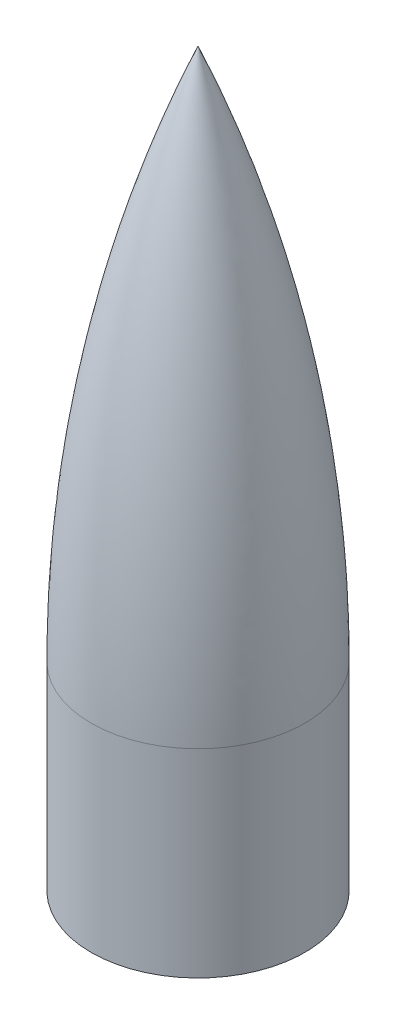
ISO-10303-21;
HEADER;
FILE_DESCRIPTION(('STEP AP214'),'2;1');
FILE_NAME('part.step','',(''),(''),'','','');
FILE_SCHEMA(('AUTOMOTIVE_DESIGN { 1 0 10303 214 1 1 1 1 }'));
ENDSEC;
DATA;
#1=APPLICATION_CONTEXT('core data for automotive mechanical design processes');
#2=APPLICATION_PROTOCOL_DEFINITION('international standard','automotive_design',2000,#1);
#3=PRODUCT_CONTEXT('',#1,'mechanical');
#4=PRODUCT('Part','Part','',(#3));
#5=PRODUCT_RELATED_PRODUCT_CATEGORY('part','',(#4));
#6=PRODUCT_DEFINITION_FORMATION('','',#4);
#7=PRODUCT_DEFINITION_CONTEXT('part definition',#1,'design');
#8=PRODUCT_DEFINITION('design','',#6,#7);
#9=PRODUCT_DEFINITION_SHAPE('','',#8);
#10=(LENGTH_UNIT() NAMED_UNIT(*) SI_UNIT(.MILLI.,.METRE.));
#11=(NAMED_UNIT(*) PLANE_ANGLE_UNIT() SI_UNIT($,.RADIAN.));
#12=(NAMED_UNIT(*) SI_UNIT($,.STERADIAN.) SOLID_ANGLE_UNIT());
#13=UNCERTAINTY_MEASURE_WITH_UNIT(LENGTH_MEASURE(1.E-05),#10,'distance_accuracy_value','');
#14=(GEOMETRIC_REPRESENTATION_CONTEXT(3) GLOBAL_UNCERTAINTY_ASSIGNED_CONTEXT((#13)) GLOBAL_UNIT_ASSIGNED_CONTEXT((#10,
#11,#12)) REPRESENTATION_CONTEXT('',''));
#15=CARTESIAN_POINT('',(0.,0.,0.));
#16=DIRECTION('',(0.,0.,1.));
#17=DIRECTION('',(1.,0.,0.));
#18=AXIS2_PLACEMENT_3D('',#15,#16,#17);
#19=CARTESIAN_POINT('',(0.,400.,0.));
#20=DIRECTION('',(0.,1.,0.));
#21=DIRECTION('',(0.,0.,1.));
#22=AXIS2_PLACEMENT_3D('',#19,#20,#21);
#23=CYLINDRICAL_SURFACE('',#22,78.35);
#24=CARTESIAN_POINT('',(0.,-150.,0.));
#25=DIRECTION('',(0.,1.,0.));
#26=DIRECTION('',(0.,0.,1.));
#27=AXIS2_PLACEMENT_3D('',#24,#25,#26);
#28=CIRCLE('',#27,78.35);
#29=CARTESIAN_POINT('',(0.,-150.,78.35));
#30=VERTEX_POINT('',#29);
#31=EDGE_CURVE('E11',#30,#30,#28,.T.);
#32=ORIENTED_EDGE('',*,*,#31,.F.);
#33=EDGE_LOOP('',(#32));
#34=FACE_BOUND('',#33,.T.);
#35=CARTESIAN_POINT('',(0.,0.,0.));
#36=DIRECTION('',(0.,1.,0.));
#37=DIRECTION('',(0.,0.,1.));
#38=AXIS2_PLACEMENT_3D('',#35,#36,#37);
#39=CIRCLE('',#38,78.3499999999999);
#40=CARTESIAN_POINT('',(0.,0.,78.3499999999999));
#41=VERTEX_POINT('',#40);
#42=EDGE_CURVE('E59',#41,#41,#39,.T.);
#43=ORIENTED_EDGE('',*,*,#42,.T.);
#44=EDGE_LOOP('',(#43));
#45=FACE_BOUND('',#44,.T.);
#46=ADVANCED_FACE('F36',(#34,#45),#23,.F.);
#47=CARTESIAN_POINT('',(78.35,-150.,0.));
#48=DIRECTION('',(0.,1.,0.));
#49=DIRECTION('',(0.,0.,1.));
#50=AXIS2_PLACEMENT_3D('',#47,#48,#49);
#51=PLANE('',#50);
#52=CARTESIAN_POINT('',(0.,-150.,0.));
#53=DIRECTION('',(0.,1.,0.));
#54=DIRECTION('',(0.,0.,1.));
#55=AXIS2_PLACEMENT_3D('',#52,#53,#54);
#56=CIRCLE('',#55,80.7500000000001);
#57=CARTESIAN_POINT('',(0.,-150.,80.7500000000001));
#58=VERTEX_POINT('',#57);
#59=EDGE_CURVE('E43',#58,#58,#56,.T.);
#60=ORIENTED_EDGE('',*,*,#59,.F.);
#61=EDGE_LOOP('',(#60));
#62=FACE_BOUND('',#61,.T.);
#63=ORIENTED_EDGE('',*,*,#31,.T.);
#64=EDGE_LOOP('',(#63));
#65=FACE_BOUND('',#64,.T.);
#66=ADVANCED_FACE('F72',(#62,#65),#51,.F.);
#67=CARTESIAN_POINT('',(0.,400.,0.));
#68=DIRECTION('',(0.,1.,0.));
#69=DIRECTION('',(0.,0.,1.));
#70=AXIS2_PLACEMENT_3D('',#67,#68,#69);
#71=CYLINDRICAL_SURFACE('',#70,80.75);
#72=ORIENTED_EDGE('',*,*,#59,.T.);
#73=EDGE_LOOP('',(#72));
#74=FACE_BOUND('',#73,.T.);
#75=CARTESIAN_POINT('',(0.,0.,0.));
#76=DIRECTION('',(0.,1.,0.));
#77=DIRECTION('',(0.,0.,1.));
#78=AXIS2_PLACEMENT_3D('',#75,#76,#77);
#79=CIRCLE('',#78,80.7499999999999);
#80=CARTESIAN_POINT('',(0.,0.,80.7499999999999));
#81=VERTEX_POINT('',#80);
#82=EDGE_CURVE('E57',#81,#81,#79,.T.);
#83=ORIENTED_EDGE('',*,*,#82,.F.);
#84=EDGE_LOOP('',(#83));
#85=FACE_BOUND('',#84,.T.);
#86=ADVANCED_FACE('F53',(#74,#85),#71,.T.);
#87=CARTESIAN_POINT('',(0.,-1.11022302462516E-13,-964.039392901324));
#88=DIRECTION('',(-1.,0.,0.));
#89=DIRECTION('',(0.,0.,1.));
#90=AXIS2_PLACEMENT_3D('',#87,#88,#89);
#91=CIRCLE('',#90,1044.78939290132);
#92=TRIMMED_CURVE('',#91,(PARAMETER_VALUE(-0.395739630101814)),
(PARAMETER_VALUE(0.395739630101814)),.T.,.PARAMETER.);
#93=CARTESIAN_POINT('',(0.,-1.11022302462516E-13,0.));
#94=DIRECTION('',(0.,1.,0.));
#95=AXIS1_PLACEMENT('',#93,#94);
#96=SURFACE_OF_REVOLUTION('',#92,#95);
#97=CARTESIAN_POINT('',(0.,402.756656622288,0.));
#98=VERTEX_POINT('',#97);
#99=VERTEX_LOOP('',#98);
#100=FACE_BOUND('',#99,.T.);
#101=ORIENTED_EDGE('',*,*,#82,.T.);
#102=EDGE_LOOP('',(#101));
#103=FACE_BOUND('',#102,.T.);
#104=ADVANCED_FACE('F49',(#100,#103),#96,.T.);
#105=CARTESIAN_POINT('',(0.,-1.11022302462516E-13,-964.039392901324));
#106=DIRECTION('',(-1.,0.,0.));
#107=DIRECTION('',(0.,0.,1.));
#108=AXIS2_PLACEMENT_3D('',#105,#106,#107);
#109=CIRCLE('',#108,1042.38939290132);
#110=TRIMMED_CURVE('',#109,(PARAMETER_VALUE(-0.390191728322816)),
(PARAMETER_VALUE(0.390191728322816)),.T.,.PARAMETER.);
#111=CARTESIAN_POINT('',(0.,-1.11022302462516E-13,0.));
#112=DIRECTION('',(0.,1.,0.));
#113=AXIS1_PLACEMENT('',#111,#112);
#114=SURFACE_OF_REVOLUTION('',#110,#113);
#115=CARTESIAN_POINT('',(-1.11022302462516E-13,396.489212170568,0.));
#116=VERTEX_POINT('',#115);
#117=VERTEX_LOOP('',#116);
#118=FACE_BOUND('',#117,.T.);
#119=ORIENTED_EDGE('',*,*,#42,.F.);
#120=EDGE_LOOP('',(#119));
#121=FACE_BOUND('',#120,.T.);
#122=ADVANCED_FACE('F52',(#118,#121),#114,.F.);
#123=CLOSED_SHELL('',(#46,#66,#86,#104,#122));
#124=MANIFOLD_SOLID_BREP('B2',#123);
#125=ADVANCED_BREP_SHAPE_REPRESENTATION('',(#18,#124),#14);
#126=SHAPE_DEFINITION_REPRESENTATION(#9,#125);
ENDSEC;
END-ISO-10303-21;
